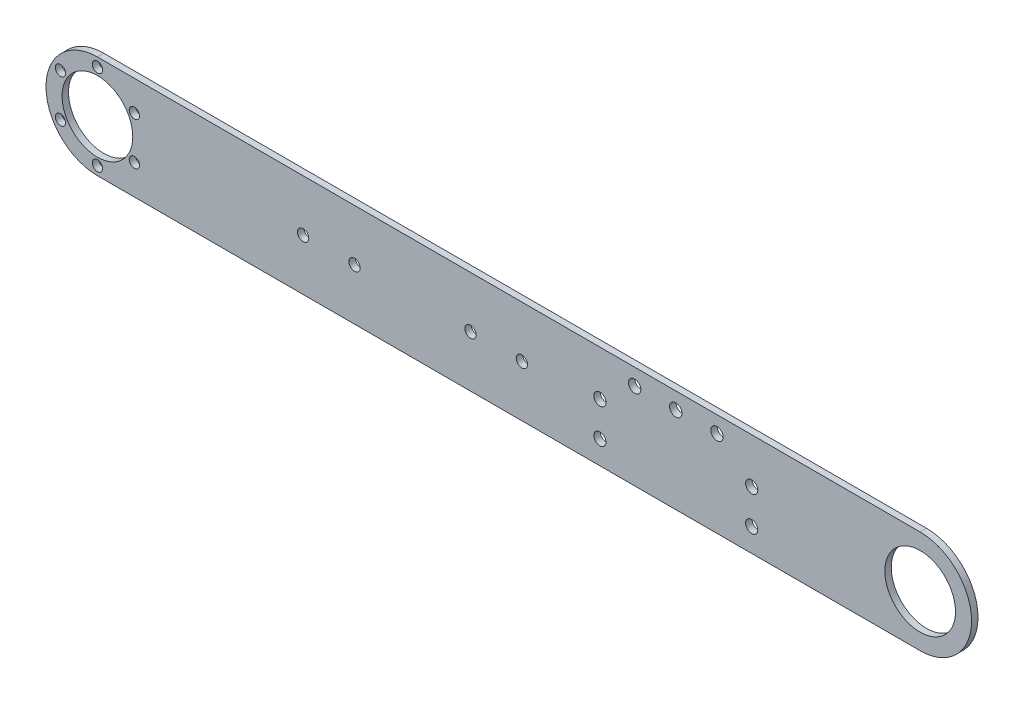
ISO-10303-21;
HEADER;
FILE_DESCRIPTION(('STEP AP214'),'2;1');
FILE_NAME('part.step','',(''),(''),'','','');
FILE_SCHEMA(('AUTOMOTIVE_DESIGN { 1 0 10303 214 1 1 1 1 }'));
ENDSEC;
DATA;
#1=APPLICATION_CONTEXT('core data for automotive mechanical design processes');
#2=APPLICATION_PROTOCOL_DEFINITION('international standard','automotive_design',2000,#1);
#3=PRODUCT_CONTEXT('',#1,'mechanical');
#4=PRODUCT('Part','Part','',(#3));
#5=PRODUCT_RELATED_PRODUCT_CATEGORY('part','',(#4));
#6=PRODUCT_DEFINITION_FORMATION('','',#4);
#7=PRODUCT_DEFINITION_CONTEXT('part definition',#1,'design');
#8=PRODUCT_DEFINITION('design','',#6,#7);
#9=PRODUCT_DEFINITION_SHAPE('','',#8);
#10=(LENGTH_UNIT() NAMED_UNIT(*) SI_UNIT(.MILLI.,.METRE.));
#11=(NAMED_UNIT(*) PLANE_ANGLE_UNIT() SI_UNIT($,.RADIAN.));
#12=(NAMED_UNIT(*) SI_UNIT($,.STERADIAN.) SOLID_ANGLE_UNIT());
#13=UNCERTAINTY_MEASURE_WITH_UNIT(LENGTH_MEASURE(1.E-05),#10,'distance_accuracy_value','');
#14=(GEOMETRIC_REPRESENTATION_CONTEXT(3) GLOBAL_UNCERTAINTY_ASSIGNED_CONTEXT((#13)) GLOBAL_UNIT_ASSIGNED_CONTEXT((#10,
#11,#12)) REPRESENTATION_CONTEXT('',''));
#15=CARTESIAN_POINT('',(0.,0.,0.));
#16=DIRECTION('',(0.,0.,1.));
#17=DIRECTION('',(1.,0.,0.));
#18=AXIS2_PLACEMENT_3D('',#15,#16,#17);
#19=CARTESIAN_POINT('',(0.,25.4,3.175));
#20=DIRECTION('',(0.,0.,-1.));
#21=DIRECTION('',(-1.,0.,0.));
#22=AXIS2_PLACEMENT_3D('',#19,#20,#21);
#23=CYLINDRICAL_SURFACE('',#22,25.4);
#24=CARTESIAN_POINT('',(0.,25.4,0.));
#25=DIRECTION('',(0.,0.,1.));
#26=DIRECTION('',(1.,0.,0.));
#27=AXIS2_PLACEMENT_3D('',#24,#25,#26);
#28=CIRCLE('',#27,25.4);
#29=CARTESIAN_POINT('',(0.,50.8,0.));
#30=VERTEX_POINT('',#29);
#31=CARTESIAN_POINT('',(0.,0.,0.));
#32=VERTEX_POINT('',#31);
#33=EDGE_CURVE('E96',#30,#32,#28,.T.);
#34=ORIENTED_EDGE('',*,*,#33,.T.);
#35=DIRECTION('',(0.,0.,-1.));
#36=VECTOR('',#35,1.);
#37=CARTESIAN_POINT('',(0.,0.,3.175));
#38=LINE('',#37,#36);
#39=CARTESIAN_POINT('',(0.,0.,3.175));
#40=VERTEX_POINT('',#39);
#41=EDGE_CURVE('E11',#40,#32,#38,.T.);
#42=ORIENTED_EDGE('',*,*,#41,.F.);
#43=CARTESIAN_POINT('',(0.,25.4,3.175));
#44=DIRECTION('',(0.,0.,1.));
#45=DIRECTION('',(1.,0.,0.));
#46=AXIS2_PLACEMENT_3D('',#43,#44,#45);
#47=CIRCLE('',#46,25.4);
#48=CARTESIAN_POINT('',(0.,50.8,3.175));
#49=VERTEX_POINT('',#48);
#50=EDGE_CURVE('E84',#49,#40,#47,.T.);
#51=ORIENTED_EDGE('',*,*,#50,.F.);
#52=DIRECTION('',(0.,0.,-1.));
#53=VECTOR('',#52,1.);
#54=CARTESIAN_POINT('',(0.,50.8,3.175));
#55=LINE('',#54,#53);
#56=EDGE_CURVE('E92',#49,#30,#55,.T.);
#57=ORIENTED_EDGE('',*,*,#56,.T.);
#58=EDGE_LOOP('',(#34,#42,#51,#57));
#59=FACE_BOUND('',#58,.T.);
#60=ADVANCED_FACE('F33',(#59),#23,.T.);
#61=CARTESIAN_POINT('',(0.,0.,3.175));
#62=DIRECTION('',(0.,1.,0.));
#63=DIRECTION('',(0.,0.,1.));
#64=AXIS2_PLACEMENT_3D('',#61,#62,#63);
#65=PLANE('',#64);
#66=DIRECTION('',(1.,0.,0.));
#67=VECTOR('',#66,1.);
#68=CARTESIAN_POINT('',(0.,0.,0.));
#69=LINE('',#68,#67);
#70=CARTESIAN_POINT('',(406.4,0.,0.));
#71=VERTEX_POINT('',#70);
#72=EDGE_CURVE('E88',#32,#71,#69,.T.);
#73=ORIENTED_EDGE('',*,*,#72,.T.);
#74=DIRECTION('',(0.,0.,-1.));
#75=VECTOR('',#74,1.);
#76=CARTESIAN_POINT('',(406.4,0.,3.175));
#77=LINE('',#76,#75);
#78=CARTESIAN_POINT('',(406.4,0.,3.175));
#79=VERTEX_POINT('',#78);
#80=EDGE_CURVE('E41',#79,#71,#77,.T.);
#81=ORIENTED_EDGE('',*,*,#80,.F.);
#82=DIRECTION('',(1.,0.,0.));
#83=VECTOR('',#82,1.);
#84=CARTESIAN_POINT('',(0.,0.,3.175));
#85=LINE('',#84,#83);
#86=EDGE_CURVE('E79',#40,#79,#85,.T.);
#87=ORIENTED_EDGE('',*,*,#86,.F.);
#88=ORIENTED_EDGE('',*,*,#41,.T.);
#89=EDGE_LOOP('',(#73,#81,#87,#88));
#90=FACE_BOUND('',#89,.T.);
#91=ADVANCED_FACE('F87',(#90),#65,.F.);
#92=CARTESIAN_POINT('',(406.4,25.4,3.175));
#93=DIRECTION('',(0.,0.,-1.));
#94=DIRECTION('',(-1.,0.,0.));
#95=AXIS2_PLACEMENT_3D('',#92,#93,#94);
#96=CYLINDRICAL_SURFACE('',#95,25.4);
#97=CARTESIAN_POINT('',(406.4,25.4,0.));
#98=DIRECTION('',(0.,0.,1.));
#99=DIRECTION('',(1.,0.,0.));
#100=AXIS2_PLACEMENT_3D('',#97,#98,#99);
#101=CIRCLE('',#100,25.4);
#102=CARTESIAN_POINT('',(406.4,50.8,0.));
#103=VERTEX_POINT('',#102);
#104=EDGE_CURVE('E66',#71,#103,#101,.T.);
#105=ORIENTED_EDGE('',*,*,#104,.T.);
#106=DIRECTION('',(0.,0.,-1.));
#107=VECTOR('',#106,1.);
#108=CARTESIAN_POINT('',(406.4,50.8,3.175));
#109=LINE('',#108,#107);
#110=CARTESIAN_POINT('',(406.4,50.8,3.175));
#111=VERTEX_POINT('',#110);
#112=EDGE_CURVE('E89',#111,#103,#109,.T.);
#113=ORIENTED_EDGE('',*,*,#112,.F.);
#114=CARTESIAN_POINT('',(406.4,25.4,3.175));
#115=DIRECTION('',(0.,0.,1.));
#116=DIRECTION('',(1.,0.,0.));
#117=AXIS2_PLACEMENT_3D('',#114,#115,#116);
#118=CIRCLE('',#117,25.4);
#119=EDGE_CURVE('E82',#79,#111,#118,.T.);
#120=ORIENTED_EDGE('',*,*,#119,.F.);
#121=ORIENTED_EDGE('',*,*,#80,.T.);
#122=EDGE_LOOP('',(#105,#113,#120,#121));
#123=FACE_BOUND('',#122,.T.);
#124=ADVANCED_FACE('F90',(#123),#96,.T.);
#125=CARTESIAN_POINT('',(0.,50.8,3.175));
#126=DIRECTION('',(0.,-1.,0.));
#127=DIRECTION('',(0.,0.,-1.));
#128=AXIS2_PLACEMENT_3D('',#125,#126,#127);
#129=PLANE('',#128);
#130=DIRECTION('',(-1.,0.,0.));
#131=VECTOR('',#130,1.);
#132=CARTESIAN_POINT('',(0.,50.8,0.));
#133=LINE('',#132,#131);
#134=EDGE_CURVE('E72',#103,#30,#133,.T.);
#135=ORIENTED_EDGE('',*,*,#134,.T.);
#136=ORIENTED_EDGE('',*,*,#56,.F.);
#137=DIRECTION('',(-1.,0.,0.));
#138=VECTOR('',#137,1.);
#139=CARTESIAN_POINT('',(0.,50.8,3.175));
#140=LINE('',#139,#138);
#141=EDGE_CURVE('E49',#111,#49,#140,.T.);
#142=ORIENTED_EDGE('',*,*,#141,.F.);
#143=ORIENTED_EDGE('',*,*,#112,.T.);
#144=EDGE_LOOP('',(#135,#136,#142,#143));
#145=FACE_BOUND('',#144,.T.);
#146=ADVANCED_FACE('F104',(#145),#129,.F.);
#147=CARTESIAN_POINT('',(0.,25.4,3.175));
#148=DIRECTION('',(0.,0.,1.));
#149=DIRECTION('',(1.,0.,0.));
#150=AXIS2_PLACEMENT_3D('',#147,#148,#149);
#151=PLANE('',#150);
#152=CARTESIAN_POINT('',(323.195176825475,28.5432896283865,3.175));
#153=DIRECTION('',(0.,0.,1.));
#154=DIRECTION('',(1.,0.,0.));
#155=AXIS2_PLACEMENT_3D('',#152,#153,#154);
#156=CIRCLE('',#155,3.00000000000954);
#157=CARTESIAN_POINT('',(326.195176825484,28.5432896283865,3.175));
#158=VERTEX_POINT('',#157);
#159=EDGE_CURVE('E213',#158,#158,#156,.T.);
#160=ORIENTED_EDGE('',*,*,#159,.F.);
#161=EDGE_LOOP('',(#160));
#162=FACE_BOUND('',#161,.T.);
#163=CARTESIAN_POINT('',(248.195176825474,11.5432896283871,3.175));
#164=DIRECTION('',(0.,0.,1.));
#165=DIRECTION('',(1.,0.,0.));
#166=AXIS2_PLACEMENT_3D('',#163,#164,#165);
#167=CIRCLE('',#166,3.0000000000095);
#168=CARTESIAN_POINT('',(251.195176825484,11.5432896283871,3.175));
#169=VERTEX_POINT('',#168);
#170=EDGE_CURVE('E206',#169,#169,#167,.T.);
#171=ORIENTED_EDGE('',*,*,#170,.F.);
#172=EDGE_LOOP('',(#171));
#173=FACE_BOUND('',#172,.T.);
#174=CARTESIAN_POINT('',(248.195176825486,28.5432896283815,3.175));
#175=DIRECTION('',(0.,0.,1.));
#176=DIRECTION('',(1.,0.,0.));
#177=AXIS2_PLACEMENT_3D('',#174,#175,#176);
#178=CIRCLE('',#177,2.99999999999906);
#179=CARTESIAN_POINT('',(251.195176825485,28.5432896283815,3.175));
#180=VERTEX_POINT('',#179);
#181=EDGE_CURVE('E218',#180,#180,#178,.T.);
#182=ORIENTED_EDGE('',*,*,#181,.F.);
#183=EDGE_LOOP('',(#182));
#184=FACE_BOUND('',#183,.T.);
#185=CARTESIAN_POINT('',(323.195176825474,11.5432896283865,3.175));
#186=DIRECTION('',(0.,0.,1.));
#187=DIRECTION('',(1.,0.,0.));
#188=AXIS2_PLACEMENT_3D('',#185,#186,#187);
#189=CIRCLE('',#188,3.00000000000938);
#190=CARTESIAN_POINT('',(326.195176825484,11.5432896283865,3.175));
#191=VERTEX_POINT('',#190);
#192=EDGE_CURVE('E200',#191,#191,#189,.T.);
#193=ORIENTED_EDGE('',*,*,#192,.F.);
#194=EDGE_LOOP('',(#193));
#195=FACE_BOUND('',#194,.T.);
#196=CARTESIAN_POINT('',(306.015176825481,42.672,3.175));
#197=DIRECTION('',(0.,0.,1.));
#198=DIRECTION('',(1.,0.,0.));
#199=AXIS2_PLACEMENT_3D('',#196,#197,#198);
#200=CIRCLE('',#199,3.04800000000001);
#201=CARTESIAN_POINT('',(309.063176825481,42.672,3.175));
#202=VERTEX_POINT('',#201);
#203=EDGE_CURVE('E195',#202,#202,#200,.T.);
#204=ORIENTED_EDGE('',*,*,#203,.F.);
#205=EDGE_LOOP('',(#204));
#206=FACE_BOUND('',#205,.T.);
#207=CARTESIAN_POINT('',(285.695176825481,42.672,3.175));
#208=DIRECTION('',(0.,0.,1.));
#209=DIRECTION('',(1.,0.,0.));
#210=AXIS2_PLACEMENT_3D('',#207,#208,#209);
#211=CIRCLE('',#210,3.04800000000001);
#212=CARTESIAN_POINT('',(288.743176825481,42.672,3.175));
#213=VERTEX_POINT('',#212);
#214=EDGE_CURVE('E189',#213,#213,#211,.T.);
#215=ORIENTED_EDGE('',*,*,#214,.F.);
#216=EDGE_LOOP('',(#215));
#217=FACE_BOUND('',#216,.T.);
#218=CARTESIAN_POINT('',(265.375176825481,42.672,3.175));
#219=DIRECTION('',(0.,0.,1.));
#220=DIRECTION('',(1.,0.,0.));
#221=AXIS2_PLACEMENT_3D('',#218,#219,#220);
#222=CIRCLE('',#221,3.04800000000001);
#223=CARTESIAN_POINT('',(268.423176825481,42.672,3.175));
#224=VERTEX_POINT('',#223);
#225=EDGE_CURVE('E182',#224,#224,#222,.T.);
#226=ORIENTED_EDGE('',*,*,#225,.F.);
#227=EDGE_LOOP('',(#226));
#228=FACE_BOUND('',#227,.T.);
#229=CARTESIAN_POINT('',(101.600000000003,25.4000000000102,3.175));
#230=DIRECTION('',(0.,0.,1.));
#231=DIRECTION('',(1.,0.,0.));
#232=AXIS2_PLACEMENT_3D('',#229,#230,#231);
#233=CIRCLE('',#232,2.79399999998773);
#234=CARTESIAN_POINT('',(104.393999999991,25.4000000000102,3.175));
#235=VERTEX_POINT('',#234);
#236=EDGE_CURVE('E177',#235,#235,#233,.T.);
#237=ORIENTED_EDGE('',*,*,#236,.F.);
#238=EDGE_LOOP('',(#237));
#239=FACE_BOUND('',#238,.T.);
#240=CARTESIAN_POINT('',(127.000000000003,25.4000000000102,3.175));
#241=DIRECTION('',(0.,0.,1.));
#242=DIRECTION('',(1.,0.,0.));
#243=AXIS2_PLACEMENT_3D('',#240,#241,#242);
#244=CIRCLE('',#243,2.79399999998771);
#245=CARTESIAN_POINT('',(129.793999999991,25.4000000000102,3.175));
#246=VERTEX_POINT('',#245);
#247=EDGE_CURVE('E171',#246,#246,#244,.T.);
#248=ORIENTED_EDGE('',*,*,#247,.F.);
#249=EDGE_LOOP('',(#248));
#250=FACE_BOUND('',#249,.T.);
#251=CARTESIAN_POINT('',(184.272931293046,25.4000000000102,3.175));
#252=DIRECTION('',(0.,0.,1.));
#253=DIRECTION('',(1.,0.,0.));
#254=AXIS2_PLACEMENT_3D('',#251,#252,#253);
#255=CIRCLE('',#254,2.79399999999588);
#256=CARTESIAN_POINT('',(187.066931293042,25.4000000000102,3.175));
#257=VERTEX_POINT('',#256);
#258=EDGE_CURVE('E165',#257,#257,#255,.T.);
#259=ORIENTED_EDGE('',*,*,#258,.F.);
#260=EDGE_LOOP('',(#259));
#261=FACE_BOUND('',#260,.T.);
#262=CARTESIAN_POINT('',(209.672931293046,25.4000000000102,3.175));
#263=DIRECTION('',(0.,0.,1.));
#264=DIRECTION('',(1.,0.,0.));
#265=AXIS2_PLACEMENT_3D('',#262,#263,#264);
#266=CIRCLE('',#265,2.79399999999588);
#267=CARTESIAN_POINT('',(212.466931293042,25.4000000000102,3.175));
#268=VERTEX_POINT('',#267);
#269=EDGE_CURVE('E158',#268,#268,#266,.T.);
#270=ORIENTED_EDGE('',*,*,#269,.F.);
#271=EDGE_LOOP('',(#270));
#272=FACE_BOUND('',#271,.T.);
#273=CARTESIAN_POINT('',(18.2575475625839,35.9410000000005,3.175));
#274=DIRECTION('',(0.,0.,1.));
#275=DIRECTION('',(1.,0.,0.));
#276=AXIS2_PLACEMENT_3D('',#273,#274,#275);
#277=CIRCLE('',#276,2.55269999999999);
#278=CARTESIAN_POINT('',(20.8102475625838,35.9410000000005,3.175));
#279=VERTEX_POINT('',#278);
#280=EDGE_CURVE('E154',#279,#279,#277,.T.);
#281=ORIENTED_EDGE('',*,*,#280,.F.);
#282=EDGE_LOOP('',(#281));
#283=FACE_BOUND('',#282,.T.);
#284=CARTESIAN_POINT('',(18.2575475625844,14.8590000000004,3.175));
#285=DIRECTION('',(0.,0.,1.));
#286=DIRECTION('',(1.,0.,0.));
#287=AXIS2_PLACEMENT_3D('',#284,#285,#286);
#288=CIRCLE('',#287,2.55269999999999);
#289=CARTESIAN_POINT('',(20.8102475625844,14.8590000000004,3.175));
#290=VERTEX_POINT('',#289);
#291=EDGE_CURVE('E148',#290,#290,#288,.T.);
#292=ORIENTED_EDGE('',*,*,#291,.F.);
#293=EDGE_LOOP('',(#292));
#294=FACE_BOUND('',#293,.T.);
#295=CARTESIAN_POINT('',(1.04083093572472E-12,4.318,3.175));
#296=DIRECTION('',(0.,0.,1.));
#297=DIRECTION('',(1.,0.,0.));
#298=AXIS2_PLACEMENT_3D('',#295,#296,#297);
#299=CIRCLE('',#298,2.55269999999999);
#300=CARTESIAN_POINT('',(2.55270000000103,4.318,3.175));
#301=VERTEX_POINT('',#300);
#302=EDGE_CURVE('E142',#301,#301,#299,.T.);
#303=ORIENTED_EDGE('',*,*,#302,.F.);
#304=EDGE_LOOP('',(#303));
#305=FACE_BOUND('',#304,.T.);
#306=CARTESIAN_POINT('',(-18.2575475625827,14.8589999999997,3.175));
#307=DIRECTION('',(0.,0.,1.));
#308=DIRECTION('',(1.,0.,0.));
#309=AXIS2_PLACEMENT_3D('',#306,#307,#308);
#310=CIRCLE('',#309,2.55269999999999);
#311=CARTESIAN_POINT('',(-15.7048475625828,14.8589999999997,3.175));
#312=VERTEX_POINT('',#311);
#313=EDGE_CURVE('E136',#312,#312,#310,.T.);
#314=ORIENTED_EDGE('',*,*,#313,.F.);
#315=EDGE_LOOP('',(#314));
#316=FACE_BOUND('',#315,.T.);
#317=CARTESIAN_POINT('',(-18.2575475625831,35.9409999999997,3.175));
#318=DIRECTION('',(0.,0.,1.));
#319=DIRECTION('',(1.,0.,0.));
#320=AXIS2_PLACEMENT_3D('',#317,#318,#319);
#321=CIRCLE('',#320,2.55269999999999);
#322=CARTESIAN_POINT('',(-15.7048475625831,35.9409999999997,3.175));
#323=VERTEX_POINT('',#322);
#324=EDGE_CURVE('E130',#323,#323,#321,.T.);
#325=ORIENTED_EDGE('',*,*,#324,.F.);
#326=EDGE_LOOP('',(#325));
#327=FACE_BOUND('',#326,.T.);
#328=CARTESIAN_POINT('',(0.,46.482,3.175));
#329=DIRECTION('',(0.,0.,1.));
#330=DIRECTION('',(1.,0.,0.));
#331=AXIS2_PLACEMENT_3D('',#328,#329,#330);
#332=CIRCLE('',#331,2.55269999999999);
#333=CARTESIAN_POINT('',(2.55269999999999,46.482,3.175));
#334=VERTEX_POINT('',#333);
#335=EDGE_CURVE('E124',#334,#334,#332,.T.);
#336=ORIENTED_EDGE('',*,*,#335,.F.);
#337=EDGE_LOOP('',(#336));
#338=FACE_BOUND('',#337,.T.);
#339=CARTESIAN_POINT('',(0.,25.4,3.175));
#340=DIRECTION('',(0.,0.,1.));
#341=DIRECTION('',(1.,0.,0.));
#342=AXIS2_PLACEMENT_3D('',#339,#340,#341);
#343=CIRCLE('',#342,17.4625);
#344=CARTESIAN_POINT('',(17.4625,25.4,3.175));
#345=VERTEX_POINT('',#344);
#346=EDGE_CURVE('E117',#345,#345,#343,.T.);
#347=ORIENTED_EDGE('',*,*,#346,.F.);
#348=EDGE_LOOP('',(#347));
#349=FACE_BOUND('',#348,.T.);
#350=CARTESIAN_POINT('',(406.4,25.4,3.175));
#351=DIRECTION('',(0.,0.,1.));
#352=DIRECTION('',(1.,0.,0.));
#353=AXIS2_PLACEMENT_3D('',#350,#351,#352);
#354=CIRCLE('',#353,17.4625);
#355=CARTESIAN_POINT('',(423.8625,25.4,3.175));
#356=VERTEX_POINT('',#355);
#357=EDGE_CURVE('E110',#356,#356,#354,.T.);
#358=ORIENTED_EDGE('',*,*,#357,.F.);
#359=EDGE_LOOP('',(#358));
#360=FACE_BOUND('',#359,.T.);
#361=ORIENTED_EDGE('',*,*,#50,.T.);
#362=ORIENTED_EDGE('',*,*,#86,.T.);
#363=ORIENTED_EDGE('',*,*,#119,.T.);
#364=ORIENTED_EDGE('',*,*,#141,.T.);
#365=EDGE_LOOP('',(#361,#362,#363,#364));
#366=FACE_BOUND('',#365,.T.);
#367=ADVANCED_FACE('F80',(#162,#173,#184,#195,#206,#217,#228,#239,#250,#261,#272,#283,#294,#305,
#316,#327,#338,#349,#360,#366),#151,.T.);
#368=CARTESIAN_POINT('',(0.,25.4,0.));
#369=DIRECTION('',(0.,0.,1.));
#370=DIRECTION('',(1.,0.,0.));
#371=AXIS2_PLACEMENT_3D('',#368,#369,#370);
#372=PLANE('',#371);
#373=CARTESIAN_POINT('',(323.195176825475,28.5432896283865,0.));
#374=DIRECTION('',(0.,0.,1.));
#375=DIRECTION('',(1.,0.,0.));
#376=AXIS2_PLACEMENT_3D('',#373,#374,#375);
#377=CIRCLE('',#376,3.00000000000954);
#378=CARTESIAN_POINT('',(326.195176825484,28.5432896283865,0.));
#379=VERTEX_POINT('',#378);
#380=EDGE_CURVE('E203',#379,#379,#377,.T.);
#381=ORIENTED_EDGE('',*,*,#380,.T.);
#382=EDGE_LOOP('',(#381));
#383=FACE_BOUND('',#382,.T.);
#384=CARTESIAN_POINT('',(248.195176825474,11.5432896283871,0.));
#385=DIRECTION('',(0.,0.,1.));
#386=DIRECTION('',(1.,0.,0.));
#387=AXIS2_PLACEMENT_3D('',#384,#385,#386);
#388=CIRCLE('',#387,3.0000000000095);
#389=CARTESIAN_POINT('',(251.195176825484,11.5432896283871,0.));
#390=VERTEX_POINT('',#389);
#391=EDGE_CURVE('E209',#390,#390,#388,.T.);
#392=ORIENTED_EDGE('',*,*,#391,.T.);
#393=EDGE_LOOP('',(#392));
#394=FACE_BOUND('',#393,.T.);
#395=CARTESIAN_POINT('',(248.195176825486,28.5432896283815,0.));
#396=DIRECTION('',(0.,0.,1.));
#397=DIRECTION('',(1.,0.,0.));
#398=AXIS2_PLACEMENT_3D('',#395,#396,#397);
#399=CIRCLE('',#398,2.99999999999906);
#400=CARTESIAN_POINT('',(251.195176825485,28.5432896283815,0.));
#401=VERTEX_POINT('',#400);
#402=EDGE_CURVE('E210',#401,#401,#399,.T.);
#403=ORIENTED_EDGE('',*,*,#402,.T.);
#404=EDGE_LOOP('',(#403));
#405=FACE_BOUND('',#404,.T.);
#406=CARTESIAN_POINT('',(323.195176825474,11.5432896283865,0.));
#407=DIRECTION('',(0.,0.,1.));
#408=DIRECTION('',(1.,0.,0.));
#409=AXIS2_PLACEMENT_3D('',#406,#407,#408);
#410=CIRCLE('',#409,3.00000000000938);
#411=CARTESIAN_POINT('',(326.195176825484,11.5432896283865,0.));
#412=VERTEX_POINT('',#411);
#413=EDGE_CURVE('E186',#412,#412,#410,.T.);
#414=ORIENTED_EDGE('',*,*,#413,.T.);
#415=EDGE_LOOP('',(#414));
#416=FACE_BOUND('',#415,.T.);
#417=CARTESIAN_POINT('',(306.015176825481,42.672,0.));
#418=DIRECTION('',(0.,0.,1.));
#419=DIRECTION('',(1.,0.,0.));
#420=AXIS2_PLACEMENT_3D('',#417,#418,#419);
#421=CIRCLE('',#420,3.04800000000001);
#422=CARTESIAN_POINT('',(309.063176825481,42.672,0.));
#423=VERTEX_POINT('',#422);
#424=EDGE_CURVE('E162',#423,#423,#421,.T.);
#425=ORIENTED_EDGE('',*,*,#424,.T.);
#426=EDGE_LOOP('',(#425));
#427=FACE_BOUND('',#426,.T.);
#428=CARTESIAN_POINT('',(285.695176825481,42.672,0.));
#429=DIRECTION('',(0.,0.,1.));
#430=DIRECTION('',(1.,0.,0.));
#431=AXIS2_PLACEMENT_3D('',#428,#429,#430);
#432=CIRCLE('',#431,3.04800000000001);
#433=CARTESIAN_POINT('',(288.743176825481,42.672,0.));
#434=VERTEX_POINT('',#433);
#435=EDGE_CURVE('E192',#434,#434,#432,.T.);
#436=ORIENTED_EDGE('',*,*,#435,.T.);
#437=EDGE_LOOP('',(#436));
#438=FACE_BOUND('',#437,.T.);
#439=CARTESIAN_POINT('',(265.375176825481,42.672,0.));
#440=DIRECTION('',(0.,0.,1.));
#441=DIRECTION('',(1.,0.,0.));
#442=AXIS2_PLACEMENT_3D('',#439,#440,#441);
#443=CIRCLE('',#442,3.04800000000001);
#444=CARTESIAN_POINT('',(268.423176825481,42.672,0.));
#445=VERTEX_POINT('',#444);
#446=EDGE_CURVE('E185',#445,#445,#443,.T.);
#447=ORIENTED_EDGE('',*,*,#446,.T.);
#448=EDGE_LOOP('',(#447));
#449=FACE_BOUND('',#448,.T.);
#450=CARTESIAN_POINT('',(101.600000000003,25.4000000000102,0.));
#451=DIRECTION('',(0.,0.,1.));
#452=DIRECTION('',(1.,0.,0.));
#453=AXIS2_PLACEMENT_3D('',#450,#451,#452);
#454=CIRCLE('',#453,2.79399999998773);
#455=CARTESIAN_POINT('',(104.393999999991,25.4000000000102,0.));
#456=VERTEX_POINT('',#455);
#457=EDGE_CURVE('E157',#456,#456,#454,.T.);
#458=ORIENTED_EDGE('',*,*,#457,.T.);
#459=EDGE_LOOP('',(#458));
#460=FACE_BOUND('',#459,.T.);
#461=CARTESIAN_POINT('',(127.000000000003,25.4000000000102,0.));
#462=DIRECTION('',(0.,0.,1.));
#463=DIRECTION('',(1.,0.,0.));
#464=AXIS2_PLACEMENT_3D('',#461,#462,#463);
#465=CIRCLE('',#464,2.79399999998771);
#466=CARTESIAN_POINT('',(129.793999999991,25.4000000000102,0.));
#467=VERTEX_POINT('',#466);
#468=EDGE_CURVE('E174',#467,#467,#465,.T.);
#469=ORIENTED_EDGE('',*,*,#468,.T.);
#470=EDGE_LOOP('',(#469));
#471=FACE_BOUND('',#470,.T.);
#472=CARTESIAN_POINT('',(184.272931293046,25.4000000000102,0.));
#473=DIRECTION('',(0.,0.,1.));
#474=DIRECTION('',(1.,0.,0.));
#475=AXIS2_PLACEMENT_3D('',#472,#473,#474);
#476=CIRCLE('',#475,2.79399999999588);
#477=CARTESIAN_POINT('',(187.066931293042,25.4000000000102,0.));
#478=VERTEX_POINT('',#477);
#479=EDGE_CURVE('E168',#478,#478,#476,.T.);
#480=ORIENTED_EDGE('',*,*,#479,.T.);
#481=EDGE_LOOP('',(#480));
#482=FACE_BOUND('',#481,.T.);
#483=CARTESIAN_POINT('',(209.672931293046,25.4000000000102,0.));
#484=DIRECTION('',(0.,0.,1.));
#485=DIRECTION('',(1.,0.,0.));
#486=AXIS2_PLACEMENT_3D('',#483,#484,#485);
#487=CIRCLE('',#486,2.79399999999588);
#488=CARTESIAN_POINT('',(212.466931293042,25.4000000000102,0.));
#489=VERTEX_POINT('',#488);
#490=EDGE_CURVE('E161',#489,#489,#487,.T.);
#491=ORIENTED_EDGE('',*,*,#490,.T.);
#492=EDGE_LOOP('',(#491));
#493=FACE_BOUND('',#492,.T.);
#494=CARTESIAN_POINT('',(18.2575475625839,35.9410000000005,0.));
#495=DIRECTION('',(0.,0.,1.));
#496=DIRECTION('',(1.,0.,0.));
#497=AXIS2_PLACEMENT_3D('',#494,#495,#496);
#498=CIRCLE('',#497,2.5527);
#499=CARTESIAN_POINT('',(20.8102475625839,35.9410000000005,0.));
#500=VERTEX_POINT('',#499);
#501=EDGE_CURVE('E151',#500,#500,#498,.T.);
#502=ORIENTED_EDGE('',*,*,#501,.T.);
#503=EDGE_LOOP('',(#502));
#504=FACE_BOUND('',#503,.T.);
#505=CARTESIAN_POINT('',(18.2575475625844,14.8590000000004,0.));
#506=DIRECTION('',(0.,0.,1.));
#507=DIRECTION('',(1.,0.,0.));
#508=AXIS2_PLACEMENT_3D('',#505,#506,#507);
#509=CIRCLE('',#508,2.5527);
#510=CARTESIAN_POINT('',(20.8102475625844,14.8590000000004,0.));
#511=VERTEX_POINT('',#510);
#512=EDGE_CURVE('E145',#511,#511,#509,.T.);
#513=ORIENTED_EDGE('',*,*,#512,.T.);
#514=EDGE_LOOP('',(#513));
#515=FACE_BOUND('',#514,.T.);
#516=CARTESIAN_POINT('',(1.04083093572472E-12,4.318,0.));
#517=DIRECTION('',(0.,0.,1.));
#518=DIRECTION('',(1.,0.,0.));
#519=AXIS2_PLACEMENT_3D('',#516,#517,#518);
#520=CIRCLE('',#519,2.5527);
#521=CARTESIAN_POINT('',(2.55270000000104,4.318,0.));
#522=VERTEX_POINT('',#521);
#523=EDGE_CURVE('E139',#522,#522,#520,.T.);
#524=ORIENTED_EDGE('',*,*,#523,.T.);
#525=EDGE_LOOP('',(#524));
#526=FACE_BOUND('',#525,.T.);
#527=CARTESIAN_POINT('',(-18.2575475625827,14.8589999999997,0.));
#528=DIRECTION('',(0.,0.,1.));
#529=DIRECTION('',(1.,0.,0.));
#530=AXIS2_PLACEMENT_3D('',#527,#528,#529);
#531=CIRCLE('',#530,2.5527);
#532=CARTESIAN_POINT('',(-15.7048475625827,14.8589999999997,0.));
#533=VERTEX_POINT('',#532);
#534=EDGE_CURVE('E133',#533,#533,#531,.T.);
#535=ORIENTED_EDGE('',*,*,#534,.T.);
#536=EDGE_LOOP('',(#535));
#537=FACE_BOUND('',#536,.T.);
#538=CARTESIAN_POINT('',(-18.2575475625831,35.9409999999997,0.));
#539=DIRECTION('',(0.,0.,1.));
#540=DIRECTION('',(1.,0.,0.));
#541=AXIS2_PLACEMENT_3D('',#538,#539,#540);
#542=CIRCLE('',#541,2.5527);
#543=CARTESIAN_POINT('',(-15.7048475625831,35.9409999999997,0.));
#544=VERTEX_POINT('',#543);
#545=EDGE_CURVE('E127',#544,#544,#542,.T.);
#546=ORIENTED_EDGE('',*,*,#545,.T.);
#547=EDGE_LOOP('',(#546));
#548=FACE_BOUND('',#547,.T.);
#549=CARTESIAN_POINT('',(0.,46.482,0.));
#550=DIRECTION('',(0.,0.,1.));
#551=DIRECTION('',(1.,0.,0.));
#552=AXIS2_PLACEMENT_3D('',#549,#550,#551);
#553=CIRCLE('',#552,2.5527);
#554=CARTESIAN_POINT('',(2.5527,46.482,0.));
#555=VERTEX_POINT('',#554);
#556=EDGE_CURVE('E114',#555,#555,#553,.T.);
#557=ORIENTED_EDGE('',*,*,#556,.T.);
#558=EDGE_LOOP('',(#557));
#559=FACE_BOUND('',#558,.T.);
#560=CARTESIAN_POINT('',(0.,25.4,0.));
#561=DIRECTION('',(0.,0.,1.));
#562=DIRECTION('',(1.,0.,0.));
#563=AXIS2_PLACEMENT_3D('',#560,#561,#562);
#564=CIRCLE('',#563,17.4625);
#565=CARTESIAN_POINT('',(17.4625,25.4,0.));
#566=VERTEX_POINT('',#565);
#567=EDGE_CURVE('E99',#566,#566,#564,.T.);
#568=ORIENTED_EDGE('',*,*,#567,.T.);
#569=EDGE_LOOP('',(#568));
#570=FACE_BOUND('',#569,.T.);
#571=CARTESIAN_POINT('',(406.4,25.4,0.));
#572=DIRECTION('',(0.,0.,1.));
#573=DIRECTION('',(1.,0.,0.));
#574=AXIS2_PLACEMENT_3D('',#571,#572,#573);
#575=CIRCLE('',#574,17.4625);
#576=CARTESIAN_POINT('',(423.8625,25.4,0.));
#577=VERTEX_POINT('',#576);
#578=EDGE_CURVE('E113',#577,#577,#575,.T.);
#579=ORIENTED_EDGE('',*,*,#578,.T.);
#580=EDGE_LOOP('',(#579));
#581=FACE_BOUND('',#580,.T.);
#582=ORIENTED_EDGE('',*,*,#33,.F.);
#583=ORIENTED_EDGE('',*,*,#134,.F.);
#584=ORIENTED_EDGE('',*,*,#104,.F.);
#585=ORIENTED_EDGE('',*,*,#72,.F.);
#586=EDGE_LOOP('',(#582,#583,#584,#585));
#587=FACE_BOUND('',#586,.T.);
#588=ADVANCED_FACE('F107',(#383,#394,#405,#416,#427,#438,#449,#460,#471,#482,#493,#504,#515,
#526,#537,#548,#559,#570,#581,#587),#372,.F.);
#589=CARTESIAN_POINT('',(406.4,25.4,0.));
#590=DIRECTION('',(0.,0.,1.));
#591=DIRECTION('',(1.,0.,0.));
#592=AXIS2_PLACEMENT_3D('',#589,#590,#591);
#593=CYLINDRICAL_SURFACE('',#592,17.4625);
#594=ORIENTED_EDGE('',*,*,#578,.F.);
#595=EDGE_LOOP('',(#594));
#596=FACE_BOUND('',#595,.T.);
#597=ORIENTED_EDGE('',*,*,#357,.T.);
#598=EDGE_LOOP('',(#597));
#599=FACE_BOUND('',#598,.T.);
#600=ADVANCED_FACE('F270',(#596,#599),#593,.F.);
#601=CARTESIAN_POINT('',(0.,25.4,0.));
#602=DIRECTION('',(0.,0.,1.));
#603=DIRECTION('',(1.,0.,0.));
#604=AXIS2_PLACEMENT_3D('',#601,#602,#603);
#605=CYLINDRICAL_SURFACE('',#604,17.4625);
#606=ORIENTED_EDGE('',*,*,#567,.F.);
#607=EDGE_LOOP('',(#606));
#608=FACE_BOUND('',#607,.T.);
#609=ORIENTED_EDGE('',*,*,#346,.T.);
#610=EDGE_LOOP('',(#609));
#611=FACE_BOUND('',#610,.T.);
#612=ADVANCED_FACE('F272',(#608,#611),#605,.F.);
#613=CARTESIAN_POINT('',(0.,46.482,3.175));
#614=DIRECTION('',(0.,0.,1.));
#615=DIRECTION('',(1.,0.,0.));
#616=AXIS2_PLACEMENT_3D('',#613,#614,#615);
#617=CYLINDRICAL_SURFACE('',#616,2.55269999999999);
#618=ORIENTED_EDGE('',*,*,#556,.F.);
#619=EDGE_LOOP('',(#618));
#620=FACE_BOUND('',#619,.T.);
#621=ORIENTED_EDGE('',*,*,#335,.T.);
#622=EDGE_LOOP('',(#621));
#623=FACE_BOUND('',#622,.T.);
#624=ADVANCED_FACE('F279',(#620,#623),#617,.F.);
#625=CARTESIAN_POINT('',(-18.2575475625831,35.9409999999997,3.175));
#626=DIRECTION('',(0.,0.,1.));
#627=DIRECTION('',(1.,0.,0.));
#628=AXIS2_PLACEMENT_3D('',#625,#626,#627);
#629=CYLINDRICAL_SURFACE('',#628,2.55269999999999);
#630=ORIENTED_EDGE('',*,*,#545,.F.);
#631=EDGE_LOOP('',(#630));
#632=FACE_BOUND('',#631,.T.);
#633=ORIENTED_EDGE('',*,*,#324,.T.);
#634=EDGE_LOOP('',(#633));
#635=FACE_BOUND('',#634,.T.);
#636=ADVANCED_FACE('F394',(#632,#635),#629,.F.);
#637=CARTESIAN_POINT('',(-18.2575475625827,14.8589999999997,3.175));
#638=DIRECTION('',(0.,0.,1.));
#639=DIRECTION('',(1.,0.,0.));
#640=AXIS2_PLACEMENT_3D('',#637,#638,#639);
#641=CYLINDRICAL_SURFACE('',#640,2.55269999999999);
#642=ORIENTED_EDGE('',*,*,#534,.F.);
#643=EDGE_LOOP('',(#642));
#644=FACE_BOUND('',#643,.T.);
#645=ORIENTED_EDGE('',*,*,#313,.T.);
#646=EDGE_LOOP('',(#645));
#647=FACE_BOUND('',#646,.T.);
#648=ADVANCED_FACE('F390',(#644,#647),#641,.F.);
#649=CARTESIAN_POINT('',(1.04083093572472E-12,4.318,3.175));
#650=DIRECTION('',(0.,0.,1.));
#651=DIRECTION('',(1.,0.,0.));
#652=AXIS2_PLACEMENT_3D('',#649,#650,#651);
#653=CYLINDRICAL_SURFACE('',#652,2.55269999999999);
#654=ORIENTED_EDGE('',*,*,#523,.F.);
#655=EDGE_LOOP('',(#654));
#656=FACE_BOUND('',#655,.T.);
#657=ORIENTED_EDGE('',*,*,#302,.T.);
#658=EDGE_LOOP('',(#657));
#659=FACE_BOUND('',#658,.T.);
#660=ADVANCED_FACE('F386',(#656,#659),#653,.F.);
#661=CARTESIAN_POINT('',(18.2575475625844,14.8590000000004,3.175));
#662=DIRECTION('',(0.,0.,1.));
#663=DIRECTION('',(1.,0.,0.));
#664=AXIS2_PLACEMENT_3D('',#661,#662,#663);
#665=CYLINDRICAL_SURFACE('',#664,2.55269999999999);
#666=ORIENTED_EDGE('',*,*,#512,.F.);
#667=EDGE_LOOP('',(#666));
#668=FACE_BOUND('',#667,.T.);
#669=ORIENTED_EDGE('',*,*,#291,.T.);
#670=EDGE_LOOP('',(#669));
#671=FACE_BOUND('',#670,.T.);
#672=ADVANCED_FACE('F382',(#668,#671),#665,.F.);
#673=CARTESIAN_POINT('',(18.2575475625839,35.9410000000005,3.175));
#674=DIRECTION('',(0.,0.,1.));
#675=DIRECTION('',(1.,0.,0.));
#676=AXIS2_PLACEMENT_3D('',#673,#674,#675);
#677=CYLINDRICAL_SURFACE('',#676,2.55269999999999);
#678=ORIENTED_EDGE('',*,*,#501,.F.);
#679=EDGE_LOOP('',(#678));
#680=FACE_BOUND('',#679,.T.);
#681=ORIENTED_EDGE('',*,*,#280,.T.);
#682=EDGE_LOOP('',(#681));
#683=FACE_BOUND('',#682,.T.);
#684=ADVANCED_FACE('F378',(#680,#683),#677,.F.);
#685=CARTESIAN_POINT('',(209.672931293046,25.4000000000102,0.));
#686=DIRECTION('',(0.,0.,1.));
#687=DIRECTION('',(1.,0.,0.));
#688=AXIS2_PLACEMENT_3D('',#685,#686,#687);
#689=CYLINDRICAL_SURFACE('',#688,2.79399999999588);
#690=ORIENTED_EDGE('',*,*,#490,.F.);
#691=EDGE_LOOP('',(#690));
#692=FACE_BOUND('',#691,.T.);
#693=ORIENTED_EDGE('',*,*,#269,.T.);
#694=EDGE_LOOP('',(#693));
#695=FACE_BOUND('',#694,.T.);
#696=ADVANCED_FACE('F374',(#692,#695),#689,.F.);
#697=CARTESIAN_POINT('',(184.272931293046,25.4000000000102,0.));
#698=DIRECTION('',(0.,0.,1.));
#699=DIRECTION('',(1.,0.,0.));
#700=AXIS2_PLACEMENT_3D('',#697,#698,#699);
#701=CYLINDRICAL_SURFACE('',#700,2.79399999999588);
#702=ORIENTED_EDGE('',*,*,#479,.F.);
#703=EDGE_LOOP('',(#702));
#704=FACE_BOUND('',#703,.T.);
#705=ORIENTED_EDGE('',*,*,#258,.T.);
#706=EDGE_LOOP('',(#705));
#707=FACE_BOUND('',#706,.T.);
#708=ADVANCED_FACE('F370',(#704,#707),#701,.F.);
#709=CARTESIAN_POINT('',(127.000000000003,25.4000000000102,0.));
#710=DIRECTION('',(0.,0.,1.));
#711=DIRECTION('',(1.,0.,0.));
#712=AXIS2_PLACEMENT_3D('',#709,#710,#711);
#713=CYLINDRICAL_SURFACE('',#712,2.79399999998771);
#714=ORIENTED_EDGE('',*,*,#468,.F.);
#715=EDGE_LOOP('',(#714));
#716=FACE_BOUND('',#715,.T.);
#717=ORIENTED_EDGE('',*,*,#247,.T.);
#718=EDGE_LOOP('',(#717));
#719=FACE_BOUND('',#718,.T.);
#720=ADVANCED_FACE('F366',(#716,#719),#713,.F.);
#721=CARTESIAN_POINT('',(101.600000000003,25.4000000000102,0.));
#722=DIRECTION('',(0.,0.,1.));
#723=DIRECTION('',(1.,0.,0.));
#724=AXIS2_PLACEMENT_3D('',#721,#722,#723);
#725=CYLINDRICAL_SURFACE('',#724,2.79399999998773);
#726=ORIENTED_EDGE('',*,*,#457,.F.);
#727=EDGE_LOOP('',(#726));
#728=FACE_BOUND('',#727,.T.);
#729=ORIENTED_EDGE('',*,*,#236,.T.);
#730=EDGE_LOOP('',(#729));
#731=FACE_BOUND('',#730,.T.);
#732=ADVANCED_FACE('F362',(#728,#731),#725,.F.);
#733=CARTESIAN_POINT('',(265.375176825481,42.672,0.));
#734=DIRECTION('',(0.,0.,1.));
#735=DIRECTION('',(1.,0.,0.));
#736=AXIS2_PLACEMENT_3D('',#733,#734,#735);
#737=CYLINDRICAL_SURFACE('',#736,3.04800000000001);
#738=ORIENTED_EDGE('',*,*,#446,.F.);
#739=EDGE_LOOP('',(#738));
#740=FACE_BOUND('',#739,.T.);
#741=ORIENTED_EDGE('',*,*,#225,.T.);
#742=EDGE_LOOP('',(#741));
#743=FACE_BOUND('',#742,.T.);
#744=ADVANCED_FACE('F358',(#740,#743),#737,.F.);
#745=CARTESIAN_POINT('',(285.695176825481,42.672,0.));
#746=DIRECTION('',(0.,0.,1.));
#747=DIRECTION('',(1.,0.,0.));
#748=AXIS2_PLACEMENT_3D('',#745,#746,#747);
#749=CYLINDRICAL_SURFACE('',#748,3.04800000000001);
#750=ORIENTED_EDGE('',*,*,#435,.F.);
#751=EDGE_LOOP('',(#750));
#752=FACE_BOUND('',#751,.T.);
#753=ORIENTED_EDGE('',*,*,#214,.T.);
#754=EDGE_LOOP('',(#753));
#755=FACE_BOUND('',#754,.T.);
#756=ADVANCED_FACE('F354',(#752,#755),#749,.F.);
#757=CARTESIAN_POINT('',(306.015176825481,42.672,0.));
#758=DIRECTION('',(0.,0.,1.));
#759=DIRECTION('',(1.,0.,0.));
#760=AXIS2_PLACEMENT_3D('',#757,#758,#759);
#761=CYLINDRICAL_SURFACE('',#760,3.04800000000001);
#762=ORIENTED_EDGE('',*,*,#424,.F.);
#763=EDGE_LOOP('',(#762));
#764=FACE_BOUND('',#763,.T.);
#765=ORIENTED_EDGE('',*,*,#203,.T.);
#766=EDGE_LOOP('',(#765));
#767=FACE_BOUND('',#766,.T.);
#768=ADVANCED_FACE('F318',(#764,#767),#761,.F.);
#769=CARTESIAN_POINT('',(323.195176825474,11.5432896283865,0.));
#770=DIRECTION('',(0.,0.,1.));
#771=DIRECTION('',(1.,0.,0.));
#772=AXIS2_PLACEMENT_3D('',#769,#770,#771);
#773=CYLINDRICAL_SURFACE('',#772,3.00000000000938);
#774=ORIENTED_EDGE('',*,*,#413,.F.);
#775=EDGE_LOOP('',(#774));
#776=FACE_BOUND('',#775,.T.);
#777=ORIENTED_EDGE('',*,*,#192,.T.);
#778=EDGE_LOOP('',(#777));
#779=FACE_BOUND('',#778,.T.);
#780=ADVANCED_FACE('F230',(#776,#779),#773,.F.);
#781=CARTESIAN_POINT('',(248.195176825486,28.5432896283815,0.));
#782=DIRECTION('',(0.,0.,1.));
#783=DIRECTION('',(1.,0.,0.));
#784=AXIS2_PLACEMENT_3D('',#781,#782,#783);
#785=CYLINDRICAL_SURFACE('',#784,2.99999999999906);
#786=ORIENTED_EDGE('',*,*,#402,.F.);
#787=EDGE_LOOP('',(#786));
#788=FACE_BOUND('',#787,.T.);
#789=ORIENTED_EDGE('',*,*,#181,.T.);
#790=EDGE_LOOP('',(#789));
#791=FACE_BOUND('',#790,.T.);
#792=ADVANCED_FACE('F226',(#788,#791),#785,.F.);
#793=CARTESIAN_POINT('',(248.195176825474,11.5432896283871,0.));
#794=DIRECTION('',(0.,0.,1.));
#795=DIRECTION('',(1.,0.,0.));
#796=AXIS2_PLACEMENT_3D('',#793,#794,#795);
#797=CYLINDRICAL_SURFACE('',#796,3.0000000000095);
#798=ORIENTED_EDGE('',*,*,#391,.F.);
#799=EDGE_LOOP('',(#798));
#800=FACE_BOUND('',#799,.T.);
#801=ORIENTED_EDGE('',*,*,#170,.T.);
#802=EDGE_LOOP('',(#801));
#803=FACE_BOUND('',#802,.T.);
#804=ADVANCED_FACE('F229',(#800,#803),#797,.F.);
#805=CARTESIAN_POINT('',(323.195176825475,28.5432896283865,0.));
#806=DIRECTION('',(0.,0.,1.));
#807=DIRECTION('',(1.,0.,0.));
#808=AXIS2_PLACEMENT_3D('',#805,#806,#807);
#809=CYLINDRICAL_SURFACE('',#808,3.00000000000954);
#810=ORIENTED_EDGE('',*,*,#380,.F.);
#811=EDGE_LOOP('',(#810));
#812=FACE_BOUND('',#811,.T.);
#813=ORIENTED_EDGE('',*,*,#159,.T.);
#814=EDGE_LOOP('',(#813));
#815=FACE_BOUND('',#814,.T.);
#816=ADVANCED_FACE('F336',(#812,#815),#809,.F.);
#817=CLOSED_SHELL('',(#60,#91,#124,#146,#367,#588,#600,#612,#624,#636,#648,#660,#672,#684,#696,
#708,#720,#732,#744,#756,#768,#780,#792,#804,#816));
#818=MANIFOLD_SOLID_BREP('B2',#817);
#819=ADVANCED_BREP_SHAPE_REPRESENTATION('',(#18,#818),#14);
#820=SHAPE_DEFINITION_REPRESENTATION(#9,#819);
ENDSEC;
END-ISO-10303-21;
